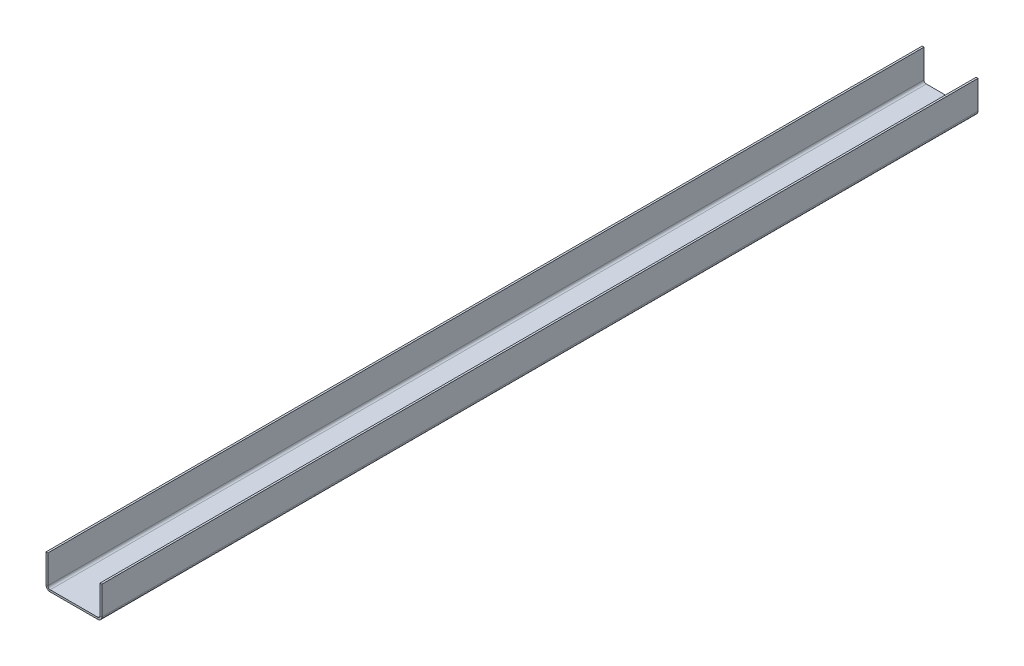
ISO-10303-21;
HEADER;
FILE_DESCRIPTION(('STEP AP214'),'2;1');
FILE_NAME('part.step','',(''),(''),'','','');
FILE_SCHEMA(('AUTOMOTIVE_DESIGN { 1 0 10303 214 1 1 1 1 }'));
ENDSEC;
DATA;
#1=APPLICATION_CONTEXT('core data for automotive mechanical design processes');
#2=APPLICATION_PROTOCOL_DEFINITION('international standard','automotive_design',2000,#1);
#3=PRODUCT_CONTEXT('',#1,'mechanical');
#4=PRODUCT('Part','Part','',(#3));
#5=PRODUCT_RELATED_PRODUCT_CATEGORY('part','',(#4));
#6=PRODUCT_DEFINITION_FORMATION('','',#4);
#7=PRODUCT_DEFINITION_CONTEXT('part definition',#1,'design');
#8=PRODUCT_DEFINITION('design','',#6,#7);
#9=PRODUCT_DEFINITION_SHAPE('','',#8);
#10=(LENGTH_UNIT() NAMED_UNIT(*) SI_UNIT(.MILLI.,.METRE.));
#11=(NAMED_UNIT(*) PLANE_ANGLE_UNIT() SI_UNIT($,.RADIAN.));
#12=(NAMED_UNIT(*) SI_UNIT($,.STERADIAN.) SOLID_ANGLE_UNIT());
#13=UNCERTAINTY_MEASURE_WITH_UNIT(LENGTH_MEASURE(1.E-05),#10,'distance_accuracy_value','');
#14=(GEOMETRIC_REPRESENTATION_CONTEXT(3) GLOBAL_UNCERTAINTY_ASSIGNED_CONTEXT((#13)) GLOBAL_UNIT_ASSIGNED_CONTEXT((#10,
#11,#12)) REPRESENTATION_CONTEXT('',''));
#15=CARTESIAN_POINT('',(0.,0.,0.));
#16=DIRECTION('',(0.,0.,1.));
#17=DIRECTION('',(1.,0.,0.));
#18=AXIS2_PLACEMENT_3D('',#15,#16,#17);
#19=CARTESIAN_POINT('',(-38.1,5.76326,1193.8));
#20=DIRECTION('',(0.,0.,1.));
#21=DIRECTION('',(1.,0.,0.));
#22=AXIS2_PLACEMENT_3D('',#19,#20,#21);
#23=PLANE('',#22);
#24=DIRECTION('',(1.,0.,0.));
#25=VECTOR('',#24,1.);
#26=CARTESIAN_POINT('',(-38.1,5.76326,1193.8));
#27=LINE('',#26,#25);
#28=CARTESIAN_POINT('',(-38.1,5.76326,1193.8));
#29=VERTEX_POINT('',#28);
#30=CARTESIAN_POINT('',(-35.51174,5.76326,1193.8));
#31=VERTEX_POINT('',#30);
#32=EDGE_CURVE('E11',#29,#31,#27,.T.);
#33=ORIENTED_EDGE('',*,*,#32,.F.);
#34=CARTESIAN_POINT('',(-32.33674,5.76326,1193.8));
#35=DIRECTION('',(0.,0.,-1.));
#36=DIRECTION('',(-1.,0.,0.));
#37=AXIS2_PLACEMENT_3D('',#34,#35,#36);
#38=CIRCLE('',#37,5.76326);
#39=CARTESIAN_POINT('',(-32.33674,0.,1193.8));
#40=VERTEX_POINT('',#39);
#41=EDGE_CURVE('E149',#29,#40,#38,.F.);
#42=ORIENTED_EDGE('',*,*,#41,.T.);
#43=DIRECTION('',(0.,-1.,0.));
#44=VECTOR('',#43,1.);
#45=CARTESIAN_POINT('',(-32.33674,2.58826,1193.8));
#46=LINE('',#45,#44);
#47=CARTESIAN_POINT('',(-32.33674,2.58826,1193.8));
#48=VERTEX_POINT('',#47);
#49=EDGE_CURVE('E47',#48,#40,#46,.T.);
#50=ORIENTED_EDGE('',*,*,#49,.F.);
#51=CARTESIAN_POINT('',(-32.33674,5.76326,1193.8));
#52=DIRECTION('',(0.,0.,1.));
#53=DIRECTION('',(1.,0.,0.));
#54=AXIS2_PLACEMENT_3D('',#51,#52,#53);
#55=CIRCLE('',#54,3.175);
#56=EDGE_CURVE('E243',#31,#48,#55,.T.);
#57=ORIENTED_EDGE('',*,*,#56,.F.);
#58=EDGE_LOOP('',(#33,#42,#50,#57));
#59=FACE_BOUND('',#58,.T.);
#60=ADVANCED_FACE('F39',(#59),#23,.T.);
#61=CARTESIAN_POINT('',(-32.33674,2.58826,1193.8));
#62=DIRECTION('',(0.,0.,1.));
#63=DIRECTION('',(1.,0.,0.));
#64=AXIS2_PLACEMENT_3D('',#61,#62,#63);
#65=PLANE('',#64);
#66=DIRECTION('',(0.,-1.,0.));
#67=VECTOR('',#66,1.);
#68=CARTESIAN_POINT('',(-38.1,44.45,1193.8));
#69=LINE('',#68,#67);
#70=CARTESIAN_POINT('',(-38.1,44.45,1193.8));
#71=VERTEX_POINT('',#70);
#72=EDGE_CURVE('E154',#71,#29,#69,.T.);
#73=ORIENTED_EDGE('',*,*,#72,.T.);
#74=ORIENTED_EDGE('',*,*,#32,.T.);
#75=DIRECTION('',(0.,1.,0.));
#76=VECTOR('',#75,1.);
#77=CARTESIAN_POINT('',(-35.51174,44.45,1193.8));
#78=LINE('',#77,#76);
#79=CARTESIAN_POINT('',(-35.51174,44.45,1193.8));
#80=VERTEX_POINT('',#79);
#81=EDGE_CURVE('E256',#80,#31,#78,.F.);
#82=ORIENTED_EDGE('',*,*,#81,.F.);
#83=DIRECTION('',(1.,0.,0.));
#84=VECTOR('',#83,1.);
#85=CARTESIAN_POINT('',(-38.1,44.45,1193.8));
#86=LINE('',#85,#84);
#87=EDGE_CURVE('E258',#71,#80,#86,.T.);
#88=ORIENTED_EDGE('',*,*,#87,.F.);
#89=EDGE_LOOP('',(#73,#74,#82,#88));
#90=FACE_BOUND('',#89,.T.);
#91=ADVANCED_FACE('F269',(#90),#65,.T.);
#92=CARTESIAN_POINT('',(-32.33674,0.,0.));
#93=DIRECTION('',(0.,0.,-1.));
#94=DIRECTION('',(-1.,0.,0.));
#95=AXIS2_PLACEMENT_3D('',#92,#93,#94);
#96=PLANE('',#95);
#97=DIRECTION('',(0.,1.,0.));
#98=VECTOR('',#97,1.);
#99=CARTESIAN_POINT('',(-32.33674,0.,0.));
#100=LINE('',#99,#98);
#101=CARTESIAN_POINT('',(-32.33674,0.,0.));
#102=VERTEX_POINT('',#101);
#103=CARTESIAN_POINT('',(-32.33674,2.58826,0.));
#104=VERTEX_POINT('',#103);
#105=EDGE_CURVE('E147',#102,#104,#100,.T.);
#106=ORIENTED_EDGE('',*,*,#105,.F.);
#107=CARTESIAN_POINT('',(-32.33674,5.76326,0.));
#108=DIRECTION('',(0.,0.,-1.));
#109=DIRECTION('',(-1.,0.,0.));
#110=AXIS2_PLACEMENT_3D('',#107,#108,#109);
#111=CIRCLE('',#110,5.76326);
#112=CARTESIAN_POINT('',(-38.1,5.76326,0.));
#113=VERTEX_POINT('',#112);
#114=EDGE_CURVE('E161',#113,#102,#111,.F.);
#115=ORIENTED_EDGE('',*,*,#114,.F.);
#116=DIRECTION('',(-1.,0.,0.));
#117=VECTOR('',#116,1.);
#118=CARTESIAN_POINT('',(-35.51174,5.76326,0.));
#119=LINE('',#118,#117);
#120=CARTESIAN_POINT('',(-35.51174,5.76326,0.));
#121=VERTEX_POINT('',#120);
#122=EDGE_CURVE('E234',#121,#113,#119,.T.);
#123=ORIENTED_EDGE('',*,*,#122,.F.);
#124=CARTESIAN_POINT('',(-32.33674,5.76326,0.));
#125=DIRECTION('',(0.,0.,1.));
#126=DIRECTION('',(1.,0.,0.));
#127=AXIS2_PLACEMENT_3D('',#124,#125,#126);
#128=CIRCLE('',#127,3.175);
#129=EDGE_CURVE('E188',#121,#104,#128,.T.);
#130=ORIENTED_EDGE('',*,*,#129,.T.);
#131=EDGE_LOOP('',(#106,#115,#123,#130));
#132=FACE_BOUND('',#131,.T.);
#133=ADVANCED_FACE('F248',(#132),#96,.T.);
#134=CARTESIAN_POINT('',(-35.51174,5.76326,0.));
#135=DIRECTION('',(0.,0.,-1.));
#136=DIRECTION('',(-1.,0.,0.));
#137=AXIS2_PLACEMENT_3D('',#134,#135,#136);
#138=PLANE('',#137);
#139=DIRECTION('',(1.,0.,0.));
#140=VECTOR('',#139,1.);
#141=CARTESIAN_POINT('',(-38.1,0.,0.));
#142=LINE('',#141,#140);
#143=CARTESIAN_POINT('',(32.3367399999999,0.,0.));
#144=VERTEX_POINT('',#143);
#145=EDGE_CURVE('E201',#102,#144,#142,.T.);
#146=ORIENTED_EDGE('',*,*,#145,.F.);
#147=ORIENTED_EDGE('',*,*,#105,.T.);
#148=DIRECTION('',(1.,0.,0.));
#149=VECTOR('',#148,1.);
#150=CARTESIAN_POINT('',(-38.1,2.58826,0.));
#151=LINE('',#150,#149);
#152=CARTESIAN_POINT('',(32.33674,2.58826,0.));
#153=VERTEX_POINT('',#152);
#154=EDGE_CURVE('E186',#104,#153,#151,.T.);
#155=ORIENTED_EDGE('',*,*,#154,.T.);
#156=DIRECTION('',(0.,-1.,0.));
#157=VECTOR('',#156,1.);
#158=CARTESIAN_POINT('',(32.33674,2.58826,0.));
#159=LINE('',#158,#157);
#160=EDGE_CURVE('E96',#153,#144,#159,.T.);
#161=ORIENTED_EDGE('',*,*,#160,.T.);
#162=EDGE_LOOP('',(#146,#147,#155,#161));
#163=FACE_BOUND('',#162,.T.);
#164=ADVANCED_FACE('F236',(#163),#138,.T.);
#165=CARTESIAN_POINT('',(32.3367399999999,0.,1193.8));
#166=DIRECTION('',(0.,0.,1.));
#167=DIRECTION('',(1.,0.,0.));
#168=AXIS2_PLACEMENT_3D('',#165,#166,#167);
#169=PLANE('',#168);
#170=DIRECTION('',(0.,1.,0.));
#171=VECTOR('',#170,1.);
#172=CARTESIAN_POINT('',(32.3367399999999,0.,1193.8));
#173=LINE('',#172,#171);
#174=CARTESIAN_POINT('',(32.3367399999999,0.,1193.8));
#175=VERTEX_POINT('',#174);
#176=CARTESIAN_POINT('',(32.33674,2.58826,1193.8));
#177=VERTEX_POINT('',#176);
#178=EDGE_CURVE('E232',#175,#177,#173,.T.);
#179=ORIENTED_EDGE('',*,*,#178,.F.);
#180=CARTESIAN_POINT('',(32.33674,5.76326,1193.8));
#181=DIRECTION('',(0.,0.,-1.));
#182=DIRECTION('',(-1.,0.,0.));
#183=AXIS2_PLACEMENT_3D('',#180,#181,#182);
#184=CIRCLE('',#183,5.76326);
#185=CARTESIAN_POINT('',(38.1,5.76326,1193.8));
#186=VERTEX_POINT('',#185);
#187=EDGE_CURVE('E169',#175,#186,#184,.F.);
#188=ORIENTED_EDGE('',*,*,#187,.T.);
#189=DIRECTION('',(1.,0.,0.));
#190=VECTOR('',#189,1.);
#191=CARTESIAN_POINT('',(35.51174,5.76326,1193.8));
#192=LINE('',#191,#190);
#193=CARTESIAN_POINT('',(35.51174,5.76326,1193.8));
#194=VERTEX_POINT('',#193);
#195=EDGE_CURVE('E55',#194,#186,#192,.T.);
#196=ORIENTED_EDGE('',*,*,#195,.F.);
#197=CARTESIAN_POINT('',(32.33674,5.76326,1193.8));
#198=DIRECTION('',(0.,0.,1.));
#199=DIRECTION('',(1.,0.,0.));
#200=AXIS2_PLACEMENT_3D('',#197,#198,#199);
#201=CIRCLE('',#200,3.175);
#202=EDGE_CURVE('E260',#177,#194,#201,.T.);
#203=ORIENTED_EDGE('',*,*,#202,.F.);
#204=EDGE_LOOP('',(#179,#188,#196,#203));
#205=FACE_BOUND('',#204,.T.);
#206=ADVANCED_FACE('F295',(#205),#169,.T.);
#207=CARTESIAN_POINT('',(35.51174,5.76326,1193.8));
#208=DIRECTION('',(0.,0.,1.));
#209=DIRECTION('',(1.,0.,0.));
#210=AXIS2_PLACEMENT_3D('',#207,#208,#209);
#211=PLANE('',#210);
#212=DIRECTION('',(1.,0.,0.));
#213=VECTOR('',#212,1.);
#214=CARTESIAN_POINT('',(-38.1,0.,1193.8));
#215=LINE('',#214,#213);
#216=EDGE_CURVE('E139',#40,#175,#215,.T.);
#217=ORIENTED_EDGE('',*,*,#216,.T.);
#218=ORIENTED_EDGE('',*,*,#178,.T.);
#219=DIRECTION('',(1.,0.,0.));
#220=VECTOR('',#219,1.);
#221=CARTESIAN_POINT('',(-38.1,2.58826,1193.8));
#222=LINE('',#221,#220);
#223=EDGE_CURVE('E142',#48,#177,#222,.T.);
#224=ORIENTED_EDGE('',*,*,#223,.F.);
#225=ORIENTED_EDGE('',*,*,#49,.T.);
#226=EDGE_LOOP('',(#217,#218,#224,#225));
#227=FACE_BOUND('',#226,.T.);
#228=ADVANCED_FACE('F137',(#227),#211,.T.);
#229=CARTESIAN_POINT('',(38.1,5.76326,0.));
#230=DIRECTION('',(0.,0.,-1.));
#231=DIRECTION('',(-1.,0.,0.));
#232=AXIS2_PLACEMENT_3D('',#229,#230,#231);
#233=PLANE('',#232);
#234=DIRECTION('',(-1.,0.,0.));
#235=VECTOR('',#234,1.);
#236=CARTESIAN_POINT('',(38.1,5.76326,0.));
#237=LINE('',#236,#235);
#238=CARTESIAN_POINT('',(38.1,5.76326,0.));
#239=VERTEX_POINT('',#238);
#240=CARTESIAN_POINT('',(35.51174,5.76326,0.));
#241=VERTEX_POINT('',#240);
#242=EDGE_CURVE('E103',#239,#241,#237,.T.);
#243=ORIENTED_EDGE('',*,*,#242,.F.);
#244=CARTESIAN_POINT('',(32.33674,5.76326,0.));
#245=DIRECTION('',(0.,0.,-1.));
#246=DIRECTION('',(-1.,0.,0.));
#247=AXIS2_PLACEMENT_3D('',#244,#245,#246);
#248=CIRCLE('',#247,5.76326);
#249=EDGE_CURVE('E203',#144,#239,#248,.F.);
#250=ORIENTED_EDGE('',*,*,#249,.F.);
#251=ORIENTED_EDGE('',*,*,#160,.F.);
#252=CARTESIAN_POINT('',(32.33674,5.76326,0.));
#253=DIRECTION('',(0.,0.,1.));
#254=DIRECTION('',(1.,0.,0.));
#255=AXIS2_PLACEMENT_3D('',#252,#253,#254);
#256=CIRCLE('',#255,3.175);
#257=EDGE_CURVE('E184',#153,#241,#256,.T.);
#258=ORIENTED_EDGE('',*,*,#257,.T.);
#259=EDGE_LOOP('',(#243,#250,#251,#258));
#260=FACE_BOUND('',#259,.T.);
#261=ADVANCED_FACE('F301',(#260),#233,.T.);
#262=CARTESIAN_POINT('',(32.33674,2.58826,0.));
#263=DIRECTION('',(0.,0.,-1.));
#264=DIRECTION('',(-1.,0.,0.));
#265=AXIS2_PLACEMENT_3D('',#262,#263,#264);
#266=PLANE('',#265);
#267=DIRECTION('',(0.,1.,0.));
#268=VECTOR('',#267,1.);
#269=CARTESIAN_POINT('',(38.1,0.,0.));
#270=LINE('',#269,#268);
#271=CARTESIAN_POINT('',(38.1,44.45,0.));
#272=VERTEX_POINT('',#271);
#273=EDGE_CURVE('E175',#239,#272,#270,.T.);
#274=ORIENTED_EDGE('',*,*,#273,.F.);
#275=ORIENTED_EDGE('',*,*,#242,.T.);
#276=DIRECTION('',(0.,1.,0.));
#277=VECTOR('',#276,1.);
#278=CARTESIAN_POINT('',(35.51174,0.,0.));
#279=LINE('',#278,#277);
#280=CARTESIAN_POINT('',(35.51174,44.45,0.));
#281=VERTEX_POINT('',#280);
#282=EDGE_CURVE('E181',#241,#281,#279,.T.);
#283=ORIENTED_EDGE('',*,*,#282,.T.);
#284=DIRECTION('',(1.,0.,0.));
#285=VECTOR('',#284,1.);
#286=CARTESIAN_POINT('',(35.51174,44.45,0.));
#287=LINE('',#286,#285);
#288=EDGE_CURVE('E178',#281,#272,#287,.T.);
#289=ORIENTED_EDGE('',*,*,#288,.T.);
#290=EDGE_LOOP('',(#274,#275,#283,#289));
#291=FACE_BOUND('',#290,.T.);
#292=ADVANCED_FACE('F304',(#291),#266,.T.);
#293=CARTESIAN_POINT('',(38.1,0.,1193.8));
#294=DIRECTION('',(-1.,0.,0.));
#295=DIRECTION('',(0.,-1.,0.));
#296=AXIS2_PLACEMENT_3D('',#293,#294,#295);
#297=PLANE('',#296);
#298=ORIENTED_EDGE('',*,*,#273,.T.);
#299=DIRECTION('',(0.,0.,-1.));
#300=VECTOR('',#299,1.);
#301=CARTESIAN_POINT('',(38.1,44.45,1193.8));
#302=LINE('',#301,#300);
#303=CARTESIAN_POINT('',(38.1,44.45,1193.8));
#304=VERTEX_POINT('',#303);
#305=EDGE_CURVE('E227',#304,#272,#302,.T.);
#306=ORIENTED_EDGE('',*,*,#305,.F.);
#307=DIRECTION('',(0.,1.,0.));
#308=VECTOR('',#307,1.);
#309=CARTESIAN_POINT('',(38.1,0.,1193.8));
#310=LINE('',#309,#308);
#311=EDGE_CURVE('E109',#186,#304,#310,.T.);
#312=ORIENTED_EDGE('',*,*,#311,.F.);
#313=DIRECTION('',(0.,0.,-1.));
#314=VECTOR('',#313,1.);
#315=CARTESIAN_POINT('',(38.1,5.76326,1193.8));
#316=LINE('',#315,#314);
#317=EDGE_CURVE('E171',#186,#239,#316,.T.);
#318=ORIENTED_EDGE('',*,*,#317,.T.);
#319=EDGE_LOOP('',(#298,#306,#312,#318));
#320=FACE_BOUND('',#319,.T.);
#321=ADVANCED_FACE('F307',(#320),#297,.F.);
#322=CARTESIAN_POINT('',(35.51174,44.45,1193.8));
#323=DIRECTION('',(0.,1.,0.));
#324=DIRECTION('',(0.,0.,1.));
#325=AXIS2_PLACEMENT_3D('',#322,#323,#324);
#326=PLANE('',#325);
#327=ORIENTED_EDGE('',*,*,#288,.F.);
#328=DIRECTION('',(0.,0.,-1.));
#329=VECTOR('',#328,1.);
#330=CARTESIAN_POINT('',(35.51174,44.45,1193.8));
#331=LINE('',#330,#329);
#332=CARTESIAN_POINT('',(35.51174,44.45,1193.8));
#333=VERTEX_POINT('',#332);
#334=EDGE_CURVE('E225',#333,#281,#331,.T.);
#335=ORIENTED_EDGE('',*,*,#334,.F.);
#336=DIRECTION('',(1.,0.,0.));
#337=VECTOR('',#336,1.);
#338=CARTESIAN_POINT('',(35.51174,44.45,1193.8));
#339=LINE('',#338,#337);
#340=EDGE_CURVE('E515',#333,#304,#339,.T.);
#341=ORIENTED_EDGE('',*,*,#340,.T.);
#342=ORIENTED_EDGE('',*,*,#305,.T.);
#343=EDGE_LOOP('',(#327,#335,#341,#342));
#344=FACE_BOUND('',#343,.T.);
#345=ADVANCED_FACE('F311',(#344),#326,.T.);
#346=CARTESIAN_POINT('',(35.51174,0.,1193.8));
#347=DIRECTION('',(-1.,0.,0.));
#348=DIRECTION('',(0.,-1.,0.));
#349=AXIS2_PLACEMENT_3D('',#346,#347,#348);
#350=PLANE('',#349);
#351=ORIENTED_EDGE('',*,*,#282,.F.);
#352=DIRECTION('',(0.,0.,-1.));
#353=VECTOR('',#352,1.);
#354=CARTESIAN_POINT('',(35.51174,5.76326,1193.8));
#355=LINE('',#354,#353);
#356=EDGE_CURVE('E222',#194,#241,#355,.T.);
#357=ORIENTED_EDGE('',*,*,#356,.F.);
#358=DIRECTION('',(0.,1.,0.));
#359=VECTOR('',#358,1.);
#360=CARTESIAN_POINT('',(35.51174,0.,1193.8));
#361=LINE('',#360,#359);
#362=EDGE_CURVE('E517',#194,#333,#361,.T.);
#363=ORIENTED_EDGE('',*,*,#362,.T.);
#364=ORIENTED_EDGE('',*,*,#334,.T.);
#365=EDGE_LOOP('',(#351,#357,#363,#364));
#366=FACE_BOUND('',#365,.T.);
#367=ADVANCED_FACE('F315',(#366),#350,.T.);
#368=CARTESIAN_POINT('',(32.33674,5.76326,1193.8));
#369=DIRECTION('',(0.,0.,-1.));
#370=DIRECTION('',(-1.,0.,0.));
#371=AXIS2_PLACEMENT_3D('',#368,#369,#370);
#372=CYLINDRICAL_SURFACE('',#371,3.175);
#373=ORIENTED_EDGE('',*,*,#257,.F.);
#374=DIRECTION('',(0.,0.,-1.));
#375=VECTOR('',#374,1.);
#376=CARTESIAN_POINT('',(32.33674,2.58826,1193.8));
#377=LINE('',#376,#375);
#378=EDGE_CURVE('E219',#177,#153,#377,.T.);
#379=ORIENTED_EDGE('',*,*,#378,.F.);
#380=ORIENTED_EDGE('',*,*,#202,.T.);
#381=ORIENTED_EDGE('',*,*,#356,.T.);
#382=EDGE_LOOP('',(#373,#379,#380,#381));
#383=FACE_BOUND('',#382,.T.);
#384=ADVANCED_FACE('F319',(#383),#372,.F.);
#385=CARTESIAN_POINT('',(-38.1,2.58826,1193.8));
#386=DIRECTION('',(0.,1.,0.));
#387=DIRECTION('',(0.,0.,1.));
#388=AXIS2_PLACEMENT_3D('',#385,#386,#387);
#389=PLANE('',#388);
#390=ORIENTED_EDGE('',*,*,#154,.F.);
#391=DIRECTION('',(0.,0.,-1.));
#392=VECTOR('',#391,1.);
#393=CARTESIAN_POINT('',(-32.33674,2.58826,1193.8));
#394=LINE('',#393,#392);
#395=EDGE_CURVE('E216',#48,#104,#394,.T.);
#396=ORIENTED_EDGE('',*,*,#395,.F.);
#397=ORIENTED_EDGE('',*,*,#223,.T.);
#398=ORIENTED_EDGE('',*,*,#378,.T.);
#399=EDGE_LOOP('',(#390,#396,#397,#398));
#400=FACE_BOUND('',#399,.T.);
#401=ADVANCED_FACE('F245',(#400),#389,.T.);
#402=CARTESIAN_POINT('',(-32.33674,5.76326,1193.8));
#403=DIRECTION('',(0.,0.,-1.));
#404=DIRECTION('',(-1.,0.,0.));
#405=AXIS2_PLACEMENT_3D('',#402,#403,#404);
#406=CYLINDRICAL_SURFACE('',#405,3.175);
#407=ORIENTED_EDGE('',*,*,#129,.F.);
#408=DIRECTION('',(0.,0.,-1.));
#409=VECTOR('',#408,1.);
#410=CARTESIAN_POINT('',(-35.51174,5.76326,1193.8));
#411=LINE('',#410,#409);
#412=EDGE_CURVE('E213',#31,#121,#411,.T.);
#413=ORIENTED_EDGE('',*,*,#412,.F.);
#414=ORIENTED_EDGE('',*,*,#56,.T.);
#415=ORIENTED_EDGE('',*,*,#395,.T.);
#416=EDGE_LOOP('',(#407,#413,#414,#415));
#417=FACE_BOUND('',#416,.T.);
#418=ADVANCED_FACE('F241',(#417),#406,.F.);
#419=CARTESIAN_POINT('',(-35.51174,44.45,1193.8));
#420=DIRECTION('',(1.,0.,0.));
#421=DIRECTION('',(0.,0.,-1.));
#422=AXIS2_PLACEMENT_3D('',#419,#420,#421);
#423=PLANE('',#422);
#424=DIRECTION('',(0.,1.,0.));
#425=VECTOR('',#424,1.);
#426=CARTESIAN_POINT('',(-35.51174,44.45,0.));
#427=LINE('',#426,#425);
#428=CARTESIAN_POINT('',(-35.51174,44.45,0.));
#429=VERTEX_POINT('',#428);
#430=EDGE_CURVE('E191',#429,#121,#427,.F.);
#431=ORIENTED_EDGE('',*,*,#430,.F.);
#432=DIRECTION('',(0.,0.,-1.));
#433=VECTOR('',#432,1.);
#434=CARTESIAN_POINT('',(-35.51174,44.45,1193.8));
#435=LINE('',#434,#433);
#436=EDGE_CURVE('E211',#80,#429,#435,.T.);
#437=ORIENTED_EDGE('',*,*,#436,.F.);
#438=ORIENTED_EDGE('',*,*,#81,.T.);
#439=ORIENTED_EDGE('',*,*,#412,.T.);
#440=EDGE_LOOP('',(#431,#437,#438,#439));
#441=FACE_BOUND('',#440,.T.);
#442=ADVANCED_FACE('F254',(#441),#423,.T.);
#443=CARTESIAN_POINT('',(-38.1,44.45,1193.8));
#444=DIRECTION('',(0.,1.,0.));
#445=DIRECTION('',(0.,0.,1.));
#446=AXIS2_PLACEMENT_3D('',#443,#444,#445);
#447=PLANE('',#446);
#448=DIRECTION('',(1.,0.,0.));
#449=VECTOR('',#448,1.);
#450=CARTESIAN_POINT('',(-38.1,44.45,0.));
#451=LINE('',#450,#449);
#452=CARTESIAN_POINT('',(-38.1,44.45,0.));
#453=VERTEX_POINT('',#452);
#454=EDGE_CURVE('E194',#453,#429,#451,.T.);
#455=ORIENTED_EDGE('',*,*,#454,.F.);
#456=DIRECTION('',(0.,0.,-1.));
#457=VECTOR('',#456,1.);
#458=CARTESIAN_POINT('',(-38.1,44.45,1193.8));
#459=LINE('',#458,#457);
#460=EDGE_CURVE('E209',#71,#453,#459,.T.);
#461=ORIENTED_EDGE('',*,*,#460,.F.);
#462=ORIENTED_EDGE('',*,*,#87,.T.);
#463=ORIENTED_EDGE('',*,*,#436,.T.);
#464=EDGE_LOOP('',(#455,#461,#462,#463));
#465=FACE_BOUND('',#464,.T.);
#466=ADVANCED_FACE('F275',(#465),#447,.T.);
#467=CARTESIAN_POINT('',(-38.1,44.45,1193.8));
#468=DIRECTION('',(1.,0.,0.));
#469=DIRECTION('',(0.,0.,-1.));
#470=AXIS2_PLACEMENT_3D('',#467,#468,#469);
#471=PLANE('',#470);
#472=DIRECTION('',(0.,-1.,0.));
#473=VECTOR('',#472,1.);
#474=CARTESIAN_POINT('',(-38.1,44.45,0.));
#475=LINE('',#474,#473);
#476=EDGE_CURVE('E197',#453,#113,#475,.T.);
#477=ORIENTED_EDGE('',*,*,#476,.T.);
#478=DIRECTION('',(0.,0.,-1.));
#479=VECTOR('',#478,1.);
#480=CARTESIAN_POINT('',(-38.1,5.76326,1193.8));
#481=LINE('',#480,#479);
#482=EDGE_CURVE('E163',#29,#113,#481,.T.);
#483=ORIENTED_EDGE('',*,*,#482,.F.);
#484=ORIENTED_EDGE('',*,*,#72,.F.);
#485=ORIENTED_EDGE('',*,*,#460,.T.);
#486=EDGE_LOOP('',(#477,#483,#484,#485));
#487=FACE_BOUND('',#486,.T.);
#488=ADVANCED_FACE('F271',(#487),#471,.F.);
#489=CARTESIAN_POINT('',(-32.33674,5.76326,1193.8));
#490=DIRECTION('',(0.,0.,-1.));
#491=DIRECTION('',(-1.,0.,0.));
#492=AXIS2_PLACEMENT_3D('',#489,#490,#491);
#493=CYLINDRICAL_SURFACE('',#492,5.76326);
#494=ORIENTED_EDGE('',*,*,#114,.T.);
#495=DIRECTION('',(0.,0.,-1.));
#496=VECTOR('',#495,1.);
#497=CARTESIAN_POINT('',(-32.33674,0.,1193.8));
#498=LINE('',#497,#496);
#499=EDGE_CURVE('E158',#40,#102,#498,.T.);
#500=ORIENTED_EDGE('',*,*,#499,.F.);
#501=ORIENTED_EDGE('',*,*,#41,.F.);
#502=ORIENTED_EDGE('',*,*,#482,.T.);
#503=EDGE_LOOP('',(#494,#500,#501,#502));
#504=FACE_BOUND('',#503,.T.);
#505=ADVANCED_FACE('F159',(#504),#493,.T.);
#506=CARTESIAN_POINT('',(-38.1,0.,1193.8));
#507=DIRECTION('',(0.,1.,0.));
#508=DIRECTION('',(0.,0.,1.));
#509=AXIS2_PLACEMENT_3D('',#506,#507,#508);
#510=PLANE('',#509);
#511=ORIENTED_EDGE('',*,*,#145,.T.);
#512=DIRECTION('',(0.,0.,-1.));
#513=VECTOR('',#512,1.);
#514=CARTESIAN_POINT('',(32.3367399999999,0.,1193.8));
#515=LINE('',#514,#513);
#516=EDGE_CURVE('E164',#175,#144,#515,.T.);
#517=ORIENTED_EDGE('',*,*,#516,.F.);
#518=ORIENTED_EDGE('',*,*,#216,.F.);
#519=ORIENTED_EDGE('',*,*,#499,.T.);
#520=EDGE_LOOP('',(#511,#517,#518,#519));
#521=FACE_BOUND('',#520,.T.);
#522=ADVANCED_FACE('F166',(#521),#510,.F.);
#523=CARTESIAN_POINT('',(32.33674,5.76326,1193.8));
#524=DIRECTION('',(0.,0.,-1.));
#525=DIRECTION('',(-1.,0.,0.));
#526=AXIS2_PLACEMENT_3D('',#523,#524,#525);
#527=CYLINDRICAL_SURFACE('',#526,5.76326);
#528=ORIENTED_EDGE('',*,*,#249,.T.);
#529=ORIENTED_EDGE('',*,*,#317,.F.);
#530=ORIENTED_EDGE('',*,*,#187,.F.);
#531=ORIENTED_EDGE('',*,*,#516,.T.);
#532=EDGE_LOOP('',(#528,#529,#530,#531));
#533=FACE_BOUND('',#532,.T.);
#534=ADVANCED_FACE('F366',(#533),#527,.T.);
#535=CARTESIAN_POINT('',(32.33674,5.76326,1193.8));
#536=DIRECTION('',(0.,0.,1.));
#537=DIRECTION('',(1.,0.,0.));
#538=AXIS2_PLACEMENT_3D('',#535,#536,#537);
#539=PLANE('',#538);
#540=ORIENTED_EDGE('',*,*,#311,.T.);
#541=ORIENTED_EDGE('',*,*,#340,.F.);
#542=ORIENTED_EDGE('',*,*,#362,.F.);
#543=ORIENTED_EDGE('',*,*,#195,.T.);
#544=EDGE_LOOP('',(#540,#541,#542,#543));
#545=FACE_BOUND('',#544,.T.);
#546=ADVANCED_FACE('F376',(#545),#539,.T.);
#547=CARTESIAN_POINT('',(32.33674,5.76326,0.));
#548=DIRECTION('',(0.,0.,1.));
#549=DIRECTION('',(1.,0.,0.));
#550=AXIS2_PLACEMENT_3D('',#547,#548,#549);
#551=PLANE('',#550);
#552=ORIENTED_EDGE('',*,*,#430,.T.);
#553=ORIENTED_EDGE('',*,*,#122,.T.);
#554=ORIENTED_EDGE('',*,*,#476,.F.);
#555=ORIENTED_EDGE('',*,*,#454,.T.);
#556=EDGE_LOOP('',(#552,#553,#554,#555));
#557=FACE_BOUND('',#556,.T.);
#558=ADVANCED_FACE('F273',(#557),#551,.F.);
#559=CLOSED_SHELL('',(#60,#91,#133,#164,#206,#228,#261,#292,#321,#345,#367,#384,#401,#418,#442,
#466,#488,#505,#522,#534,#546,#558));
#560=MANIFOLD_SOLID_BREP('B2',#559);
#561=ADVANCED_BREP_SHAPE_REPRESENTATION('',(#18,#560),#14);
#562=SHAPE_DEFINITION_REPRESENTATION(#9,#561);
ENDSEC;
END-ISO-10303-21;
